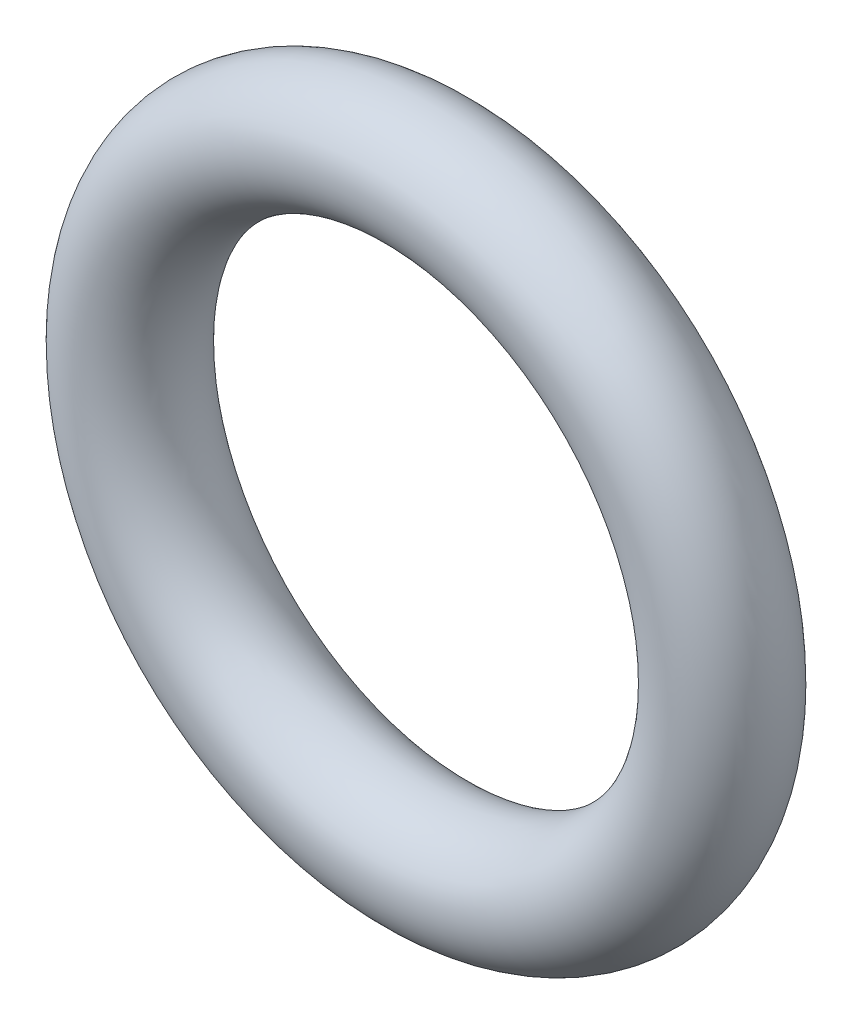
ISO-10303-21;
HEADER;
FILE_DESCRIPTION(('STEP AP214'),'2;1');
FILE_NAME('part.step','',(''),(''),'','','');
FILE_SCHEMA(('AUTOMOTIVE_DESIGN { 1 0 10303 214 1 1 1 1 }'));
ENDSEC;
DATA;
#1=APPLICATION_CONTEXT('core data for automotive mechanical design processes');
#2=APPLICATION_PROTOCOL_DEFINITION('international standard','automotive_design',2000,#1);
#3=PRODUCT_CONTEXT('',#1,'mechanical');
#4=PRODUCT('Part','Part','',(#3));
#5=PRODUCT_RELATED_PRODUCT_CATEGORY('part','',(#4));
#6=PRODUCT_DEFINITION_FORMATION('','',#4);
#7=PRODUCT_DEFINITION_CONTEXT('part definition',#1,'design');
#8=PRODUCT_DEFINITION('design','',#6,#7);
#9=PRODUCT_DEFINITION_SHAPE('','',#8);
#10=(LENGTH_UNIT() NAMED_UNIT(*) SI_UNIT(.MILLI.,.METRE.));
#11=(NAMED_UNIT(*) PLANE_ANGLE_UNIT() SI_UNIT($,.RADIAN.));
#12=(NAMED_UNIT(*) SI_UNIT($,.STERADIAN.) SOLID_ANGLE_UNIT());
#13=UNCERTAINTY_MEASURE_WITH_UNIT(LENGTH_MEASURE(1.E-05),#10,'distance_accuracy_value','');
#14=(GEOMETRIC_REPRESENTATION_CONTEXT(3) GLOBAL_UNCERTAINTY_ASSIGNED_CONTEXT((#13)) GLOBAL_UNIT_ASSIGNED_CONTEXT((#10,
#11,#12)) REPRESENTATION_CONTEXT('',''));
#15=CARTESIAN_POINT('',(0.,0.,0.));
#16=DIRECTION('',(0.,0.,1.));
#17=DIRECTION('',(1.,0.,0.));
#18=AXIS2_PLACEMENT_3D('',#15,#16,#17);
#19=CARTESIAN_POINT('',(0.,0.,0.));
#20=DIRECTION('',(0.,0.,-1.));
#21=DIRECTION('',(-1.,0.,0.));
#22=AXIS2_PLACEMENT_3D('',#19,#20,#21);
#23=TOROIDAL_SURFACE('',#22,1.25,0.25);
#24=CARTESIAN_POINT('',(-1.5,0.,0.));
#25=VERTEX_POINT('',#24);
#26=VERTEX_LOOP('',#25);
#27=FACE_BOUND('',#26,.T.);
#28=ADVANCED_FACE('F41',(#27),#23,.T.);
#29=CLOSED_SHELL('',(#28));
#30=MANIFOLD_SOLID_BREP('B2',#29);
#31=ADVANCED_BREP_SHAPE_REPRESENTATION('',(#18,#30),#14);
#32=SHAPE_DEFINITION_REPRESENTATION(#9,#31);
ENDSEC;
END-ISO-10303-21;
